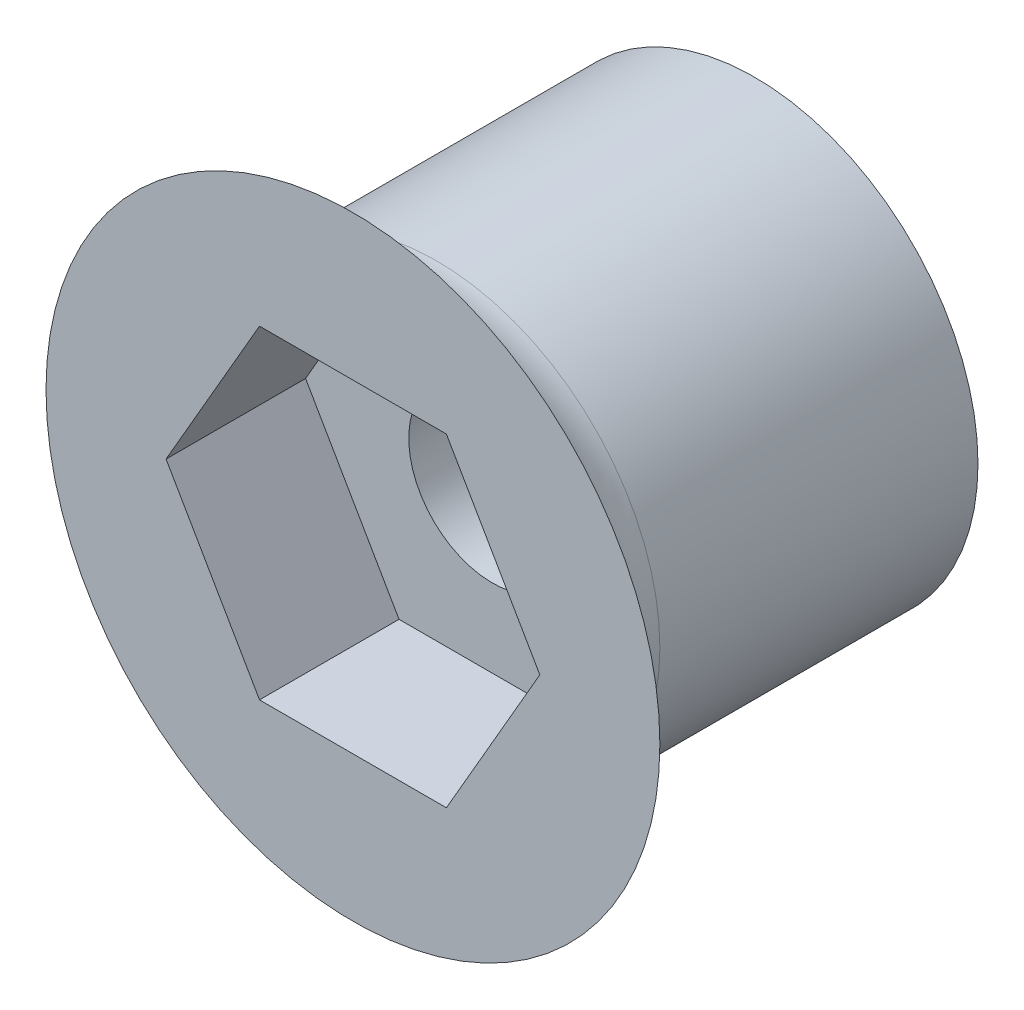
ISO-10303-21;
HEADER;
FILE_DESCRIPTION(('STEP AP214'),'2;1');
FILE_NAME('part.step','',(''),(''),'','','');
FILE_SCHEMA(('AUTOMOTIVE_DESIGN { 1 0 10303 214 1 1 1 1 }'));
ENDSEC;
DATA;
#1=APPLICATION_CONTEXT('core data for automotive mechanical design processes');
#2=APPLICATION_PROTOCOL_DEFINITION('international standard','automotive_design',2000,#1);
#3=PRODUCT_CONTEXT('',#1,'mechanical');
#4=PRODUCT('Part','Part','',(#3));
#5=PRODUCT_RELATED_PRODUCT_CATEGORY('part','',(#4));
#6=PRODUCT_DEFINITION_FORMATION('','',#4);
#7=PRODUCT_DEFINITION_CONTEXT('part definition',#1,'design');
#8=PRODUCT_DEFINITION('design','',#6,#7);
#9=PRODUCT_DEFINITION_SHAPE('','',#8);
#10=(LENGTH_UNIT() NAMED_UNIT(*) SI_UNIT(.MILLI.,.METRE.));
#11=(NAMED_UNIT(*) PLANE_ANGLE_UNIT() SI_UNIT($,.RADIAN.));
#12=(NAMED_UNIT(*) SI_UNIT($,.STERADIAN.) SOLID_ANGLE_UNIT());
#13=UNCERTAINTY_MEASURE_WITH_UNIT(LENGTH_MEASURE(1.E-05),#10,'distance_accuracy_value','');
#14=(GEOMETRIC_REPRESENTATION_CONTEXT(3) GLOBAL_UNCERTAINTY_ASSIGNED_CONTEXT((#13)) GLOBAL_UNIT_ASSIGNED_CONTEXT((#10,
#11,#12)) REPRESENTATION_CONTEXT('',''));
#15=CARTESIAN_POINT('',(0.,0.,0.));
#16=DIRECTION('',(0.,0.,1.));
#17=DIRECTION('',(1.,0.,0.));
#18=AXIS2_PLACEMENT_3D('',#15,#16,#17);
#19=CARTESIAN_POINT('',(0.,0.,0.));
#20=DIRECTION('',(0.,0.,1.));
#21=DIRECTION('',(1.,0.,0.));
#22=AXIS2_PLACEMENT_3D('',#19,#20,#21);
#23=CYLINDRICAL_SURFACE('',#22,1.5);
#24=CARTESIAN_POINT('',(0.,0.,-7.2));
#25=DIRECTION('',(0.,0.,1.));
#26=DIRECTION('',(1.,0.,0.));
#27=AXIS2_PLACEMENT_3D('',#24,#25,#26);
#28=CIRCLE('',#27,1.5);
#29=CARTESIAN_POINT('',(1.5,0.,-7.2));
#30=VERTEX_POINT('',#29);
#31=EDGE_CURVE('E11',#30,#30,#28,.T.);
#32=ORIENTED_EDGE('',*,*,#31,.F.);
#33=EDGE_LOOP('',(#32));
#34=FACE_BOUND('',#33,.T.);
#35=CARTESIAN_POINT('',(0.,0.,-2.5));
#36=DIRECTION('',(0.,0.,1.));
#37=DIRECTION('',(1.,0.,0.));
#38=AXIS2_PLACEMENT_3D('',#35,#36,#37);
#39=CIRCLE('',#38,1.5);
#40=CARTESIAN_POINT('',(1.5,0.,-2.5));
#41=VERTEX_POINT('',#40);
#42=EDGE_CURVE('E36',#41,#41,#39,.F.);
#43=ORIENTED_EDGE('',*,*,#42,.F.);
#44=EDGE_LOOP('',(#43));
#45=FACE_BOUND('',#44,.T.);
#46=ADVANCED_FACE('F33',(#34,#45),#23,.F.);
#47=CARTESIAN_POINT('',(-1.5,0.,-7.2));
#48=DIRECTION('',(0.,0.,1.));
#49=DIRECTION('',(1.,0.,0.));
#50=AXIS2_PLACEMENT_3D('',#47,#48,#49);
#51=PLANE('',#50);
#52=CARTESIAN_POINT('',(0.,0.,-7.2));
#53=DIRECTION('',(0.,0.,1.));
#54=DIRECTION('',(1.,0.,0.));
#55=AXIS2_PLACEMENT_3D('',#52,#53,#54);
#56=CIRCLE('',#55,4.);
#57=CARTESIAN_POINT('',(4.,0.,-7.2));
#58=VERTEX_POINT('',#57);
#59=EDGE_CURVE('E41',#58,#58,#56,.T.);
#60=ORIENTED_EDGE('',*,*,#59,.F.);
#61=EDGE_LOOP('',(#60));
#62=FACE_BOUND('',#61,.T.);
#63=ORIENTED_EDGE('',*,*,#31,.T.);
#64=EDGE_LOOP('',(#63));
#65=FACE_BOUND('',#64,.T.);
#66=ADVANCED_FACE('F152',(#62,#65),#51,.F.);
#67=CARTESIAN_POINT('',(0.,0.,0.));
#68=DIRECTION('',(0.,0.,1.));
#69=DIRECTION('',(1.,0.,0.));
#70=AXIS2_PLACEMENT_3D('',#67,#68,#69);
#71=CYLINDRICAL_SURFACE('',#70,4.);
#72=CARTESIAN_POINT('',(0.,0.,-1.5));
#73=DIRECTION('',(0.,0.,1.));
#74=DIRECTION('',(1.,0.,0.));
#75=AXIS2_PLACEMENT_3D('',#72,#73,#74);
#76=CIRCLE('',#75,4.);
#77=CARTESIAN_POINT('',(4.,0.,-1.5));
#78=VERTEX_POINT('',#77);
#79=EDGE_CURVE('E144',#78,#78,#76,.T.);
#80=ORIENTED_EDGE('',*,*,#79,.F.);
#81=EDGE_LOOP('',(#80));
#82=FACE_BOUND('',#81,.T.);
#83=ORIENTED_EDGE('',*,*,#59,.T.);
#84=EDGE_LOOP('',(#83));
#85=FACE_BOUND('',#84,.T.);
#86=ADVANCED_FACE('F150',(#82,#85),#71,.T.);
#87=CARTESIAN_POINT('',(0.,0.,-1.5));
#88=DIRECTION('',(0.,0.,1.));
#89=DIRECTION('',(1.,0.,0.));
#90=AXIS2_PLACEMENT_3D('',#87,#88,#89);
#91=TOROIDAL_SURFACE('',#90,5.5,1.5);
#92=CARTESIAN_POINT('',(0.,0.,0.));
#93=DIRECTION('',(0.,0.,1.));
#94=DIRECTION('',(1.,0.,0.));
#95=AXIS2_PLACEMENT_3D('',#92,#93,#94);
#96=CIRCLE('',#95,5.5);
#97=CARTESIAN_POINT('',(5.5,0.,0.));
#98=VERTEX_POINT('',#97);
#99=EDGE_CURVE('E141',#98,#98,#96,.T.);
#100=ORIENTED_EDGE('',*,*,#99,.F.);
#101=EDGE_LOOP('',(#100));
#102=FACE_BOUND('',#101,.T.);
#103=ORIENTED_EDGE('',*,*,#79,.T.);
#104=EDGE_LOOP('',(#103));
#105=FACE_BOUND('',#104,.T.);
#106=ADVANCED_FACE('F171',(#102,#105),#91,.F.);
#107=CARTESIAN_POINT('',(-1.5,0.,0.));
#108=DIRECTION('',(0.,0.,-1.));
#109=DIRECTION('',(-1.,0.,0.));
#110=AXIS2_PLACEMENT_3D('',#107,#108,#109);
#111=PLANE('',#110);
#112=DIRECTION('',(-1.,0.,0.));
#113=VECTOR('',#112,1.);
#114=CARTESIAN_POINT('',(1.67431578064992,2.9,0.));
#115=LINE('',#114,#113);
#116=CARTESIAN_POINT('',(1.67431578064992,2.9,0.));
#117=VERTEX_POINT('',#116);
#118=CARTESIAN_POINT('',(-1.67431578064992,2.9,0.));
#119=VERTEX_POINT('',#118);
#120=EDGE_CURVE('E123',#117,#119,#115,.T.);
#121=ORIENTED_EDGE('',*,*,#120,.F.);
#122=DIRECTION('',(-0.5,0.866025403784439,0.));
#123=VECTOR('',#122,1.);
#124=CARTESIAN_POINT('',(3.34863156129983,0.,0.));
#125=LINE('',#124,#123);
#126=CARTESIAN_POINT('',(3.34863156129983,0.,0.));
#127=VERTEX_POINT('',#126);
#128=EDGE_CURVE('E48',#127,#117,#125,.T.);
#129=ORIENTED_EDGE('',*,*,#128,.F.);
#130=DIRECTION('',(0.5,0.866025403784439,0.));
#131=VECTOR('',#130,1.);
#132=CARTESIAN_POINT('',(1.67431578064991,-2.9,0.));
#133=LINE('',#132,#131);
#134=CARTESIAN_POINT('',(1.67431578064991,-2.9,0.));
#135=VERTEX_POINT('',#134);
#136=EDGE_CURVE('E132',#135,#127,#133,.T.);
#137=ORIENTED_EDGE('',*,*,#136,.F.);
#138=DIRECTION('',(1.,0.,0.));
#139=VECTOR('',#138,1.);
#140=CARTESIAN_POINT('',(-1.67431578064992,-2.9,0.));
#141=LINE('',#140,#139);
#142=CARTESIAN_POINT('',(-1.67431578064992,-2.9,0.));
#143=VERTEX_POINT('',#142);
#144=EDGE_CURVE('E130',#143,#135,#141,.T.);
#145=ORIENTED_EDGE('',*,*,#144,.F.);
#146=DIRECTION('',(0.5,-0.866025403784439,0.));
#147=VECTOR('',#146,1.);
#148=CARTESIAN_POINT('',(-3.34863156129983,0.,0.));
#149=LINE('',#148,#147);
#150=CARTESIAN_POINT('',(-3.34863156129983,0.,0.));
#151=VERTEX_POINT('',#150);
#152=EDGE_CURVE('E96',#151,#143,#149,.T.);
#153=ORIENTED_EDGE('',*,*,#152,.F.);
#154=DIRECTION('',(-0.5,-0.866025403784439,0.));
#155=VECTOR('',#154,1.);
#156=CARTESIAN_POINT('',(-1.67431578064992,2.9,0.));
#157=LINE('',#156,#155);
#158=EDGE_CURVE('E126',#119,#151,#157,.T.);
#159=ORIENTED_EDGE('',*,*,#158,.F.);
#160=EDGE_LOOP('',(#121,#129,#137,#145,#153,#159));
#161=FACE_BOUND('',#160,.T.);
#162=ORIENTED_EDGE('',*,*,#99,.T.);
#163=EDGE_LOOP('',(#162));
#164=FACE_BOUND('',#163,.T.);
#165=ADVANCED_FACE('F163',(#161,#164),#111,.F.);
#166=CARTESIAN_POINT('',(0.,0.,-2.5));
#167=DIRECTION('',(0.,0.,1.));
#168=DIRECTION('',(1.,0.,0.));
#169=AXIS2_PLACEMENT_3D('',#166,#167,#168);
#170=PLANE('',#169);
#171=DIRECTION('',(-0.5,0.866025403784439,0.));
#172=VECTOR('',#171,1.);
#173=CARTESIAN_POINT('',(3.34863156129983,0.,-2.5));
#174=LINE('',#173,#172);
#175=CARTESIAN_POINT('',(3.34863156129983,0.,-2.5));
#176=VERTEX_POINT('',#175);
#177=CARTESIAN_POINT('',(1.67431578064992,2.9,-2.5));
#178=VERTEX_POINT('',#177);
#179=EDGE_CURVE('E134',#176,#178,#174,.T.);
#180=ORIENTED_EDGE('',*,*,#179,.T.);
#181=DIRECTION('',(-1.,0.,0.));
#182=VECTOR('',#181,1.);
#183=CARTESIAN_POINT('',(1.67431578064992,2.9,-2.5));
#184=LINE('',#183,#182);
#185=CARTESIAN_POINT('',(-1.67431578064992,2.9,-2.5));
#186=VERTEX_POINT('',#185);
#187=EDGE_CURVE('E117',#178,#186,#184,.T.);
#188=ORIENTED_EDGE('',*,*,#187,.T.);
#189=DIRECTION('',(-0.5,-0.866025403784439,0.));
#190=VECTOR('',#189,1.);
#191=CARTESIAN_POINT('',(-1.67431578064992,2.9,-2.5));
#192=LINE('',#191,#190);
#193=CARTESIAN_POINT('',(-3.34863156129983,0.,-2.5));
#194=VERTEX_POINT('',#193);
#195=EDGE_CURVE('E115',#186,#194,#192,.T.);
#196=ORIENTED_EDGE('',*,*,#195,.T.);
#197=DIRECTION('',(0.5,-0.866025403784439,0.));
#198=VECTOR('',#197,1.);
#199=CARTESIAN_POINT('',(-3.34863156129983,0.,-2.5));
#200=LINE('',#199,#198);
#201=CARTESIAN_POINT('',(-1.67431578064992,-2.9,-2.5));
#202=VERTEX_POINT('',#201);
#203=EDGE_CURVE('E93',#194,#202,#200,.T.);
#204=ORIENTED_EDGE('',*,*,#203,.T.);
#205=DIRECTION('',(1.,0.,0.));
#206=VECTOR('',#205,1.);
#207=CARTESIAN_POINT('',(-1.67431578064992,-2.9,-2.5));
#208=LINE('',#207,#206);
#209=CARTESIAN_POINT('',(1.67431578064991,-2.9,-2.5));
#210=VERTEX_POINT('',#209);
#211=EDGE_CURVE('E104',#202,#210,#208,.T.);
#212=ORIENTED_EDGE('',*,*,#211,.T.);
#213=DIRECTION('',(0.5,0.866025403784439,0.));
#214=VECTOR('',#213,1.);
#215=CARTESIAN_POINT('',(1.67431578064991,-2.9,-2.5));
#216=LINE('',#215,#214);
#217=EDGE_CURVE('E108',#210,#176,#216,.T.);
#218=ORIENTED_EDGE('',*,*,#217,.T.);
#219=EDGE_LOOP('',(#180,#188,#196,#204,#212,#218));
#220=FACE_BOUND('',#219,.T.);
#221=ORIENTED_EDGE('',*,*,#42,.T.);
#222=EDGE_LOOP('',(#221));
#223=FACE_BOUND('',#222,.T.);
#224=ADVANCED_FACE('F111',(#220,#223),#170,.T.);
#225=CARTESIAN_POINT('',(3.34863156129983,0.,-2.5));
#226=DIRECTION('',(0.866025403784439,0.5,0.));
#227=DIRECTION('',(-0.5,0.866025403784439,0.));
#228=AXIS2_PLACEMENT_3D('',#225,#226,#227);
#229=PLANE('',#228);
#230=ORIENTED_EDGE('',*,*,#128,.T.);
#231=DIRECTION('',(0.,0.,1.));
#232=VECTOR('',#231,1.);
#233=CARTESIAN_POINT('',(1.67431578064992,2.9,-2.5));
#234=LINE('',#233,#232);
#235=EDGE_CURVE('E78',#178,#117,#234,.T.);
#236=ORIENTED_EDGE('',*,*,#235,.F.);
#237=ORIENTED_EDGE('',*,*,#179,.F.);
#238=DIRECTION('',(0.,0.,1.));
#239=VECTOR('',#238,1.);
#240=CARTESIAN_POINT('',(3.34863156129983,0.,-2.5));
#241=LINE('',#240,#239);
#242=EDGE_CURVE('E56',#176,#127,#241,.T.);
#243=ORIENTED_EDGE('',*,*,#242,.T.);
#244=EDGE_LOOP('',(#230,#236,#237,#243));
#245=FACE_BOUND('',#244,.T.);
#246=ADVANCED_FACE('F162',(#245),#229,.F.);
#247=CARTESIAN_POINT('',(1.67431578064991,-2.9,-2.5));
#248=DIRECTION('',(0.866025403784438,-0.5,0.));
#249=DIRECTION('',(0.5,0.866025403784438,0.));
#250=AXIS2_PLACEMENT_3D('',#247,#248,#249);
#251=PLANE('',#250);
#252=ORIENTED_EDGE('',*,*,#136,.T.);
#253=ORIENTED_EDGE('',*,*,#242,.F.);
#254=ORIENTED_EDGE('',*,*,#217,.F.);
#255=DIRECTION('',(0.,0.,1.));
#256=VECTOR('',#255,1.);
#257=CARTESIAN_POINT('',(1.67431578064991,-2.9,-2.5));
#258=LINE('',#257,#256);
#259=EDGE_CURVE('E100',#210,#135,#258,.T.);
#260=ORIENTED_EDGE('',*,*,#259,.T.);
#261=EDGE_LOOP('',(#252,#253,#254,#260));
#262=FACE_BOUND('',#261,.T.);
#263=ADVANCED_FACE('F169',(#262),#251,.F.);
#264=CARTESIAN_POINT('',(-1.67431578064992,-2.9,-2.5));
#265=DIRECTION('',(0.,-1.,0.));
#266=DIRECTION('',(1.,0.,0.));
#267=AXIS2_PLACEMENT_3D('',#264,#265,#266);
#268=PLANE('',#267);
#269=ORIENTED_EDGE('',*,*,#144,.T.);
#270=ORIENTED_EDGE('',*,*,#259,.F.);
#271=ORIENTED_EDGE('',*,*,#211,.F.);
#272=DIRECTION('',(0.,0.,1.));
#273=VECTOR('',#272,1.);
#274=CARTESIAN_POINT('',(-1.67431578064992,-2.9,-2.5));
#275=LINE('',#274,#273);
#276=EDGE_CURVE('E89',#202,#143,#275,.T.);
#277=ORIENTED_EDGE('',*,*,#276,.T.);
#278=EDGE_LOOP('',(#269,#270,#271,#277));
#279=FACE_BOUND('',#278,.T.);
#280=ADVANCED_FACE('F105',(#279),#268,.F.);
#281=CARTESIAN_POINT('',(-3.34863156129983,0.,-2.5));
#282=DIRECTION('',(-0.866025403784439,-0.5,0.));
#283=DIRECTION('',(0.5,-0.866025403784439,0.));
#284=AXIS2_PLACEMENT_3D('',#281,#282,#283);
#285=PLANE('',#284);
#286=ORIENTED_EDGE('',*,*,#152,.T.);
#287=ORIENTED_EDGE('',*,*,#276,.F.);
#288=ORIENTED_EDGE('',*,*,#203,.F.);
#289=DIRECTION('',(0.,0.,1.));
#290=VECTOR('',#289,1.);
#291=CARTESIAN_POINT('',(-3.34863156129983,0.,-2.5));
#292=LINE('',#291,#290);
#293=EDGE_CURVE('E101',#194,#151,#292,.T.);
#294=ORIENTED_EDGE('',*,*,#293,.T.);
#295=EDGE_LOOP('',(#286,#287,#288,#294));
#296=FACE_BOUND('',#295,.T.);
#297=ADVANCED_FACE('F91',(#296),#285,.F.);
#298=CARTESIAN_POINT('',(-1.67431578064992,2.9,-2.5));
#299=DIRECTION('',(-0.866025403784438,0.5,0.));
#300=DIRECTION('',(-0.5,-0.866025403784438,0.));
#301=AXIS2_PLACEMENT_3D('',#298,#299,#300);
#302=PLANE('',#301);
#303=ORIENTED_EDGE('',*,*,#158,.T.);
#304=ORIENTED_EDGE('',*,*,#293,.F.);
#305=ORIENTED_EDGE('',*,*,#195,.F.);
#306=DIRECTION('',(0.,0.,1.));
#307=VECTOR('',#306,1.);
#308=CARTESIAN_POINT('',(-1.67431578064992,2.9,-2.5));
#309=LINE('',#308,#307);
#310=EDGE_CURVE('E138',#186,#119,#309,.T.);
#311=ORIENTED_EDGE('',*,*,#310,.T.);
#312=EDGE_LOOP('',(#303,#304,#305,#311));
#313=FACE_BOUND('',#312,.T.);
#314=ADVANCED_FACE('F181',(#313),#302,.F.);
#315=CARTESIAN_POINT('',(1.67431578064992,2.9,-2.5));
#316=DIRECTION('',(0.,1.,0.));
#317=DIRECTION('',(0.,0.,1.));
#318=AXIS2_PLACEMENT_3D('',#315,#316,#317);
#319=PLANE('',#318);
#320=ORIENTED_EDGE('',*,*,#120,.T.);
#321=ORIENTED_EDGE('',*,*,#310,.F.);
#322=ORIENTED_EDGE('',*,*,#187,.F.);
#323=ORIENTED_EDGE('',*,*,#235,.T.);
#324=EDGE_LOOP('',(#320,#321,#322,#323));
#325=FACE_BOUND('',#324,.T.);
#326=ADVANCED_FACE('F184',(#325),#319,.F.);
#327=CLOSED_SHELL('',(#46,#66,#86,#106,#165,#224,#246,#263,#280,#297,#314,#326));
#328=MANIFOLD_SOLID_BREP('B2',#327);
#329=ADVANCED_BREP_SHAPE_REPRESENTATION('',(#18,#328),#14);
#330=SHAPE_DEFINITION_REPRESENTATION(#9,#329);
ENDSEC;
END-ISO-10303-21;
